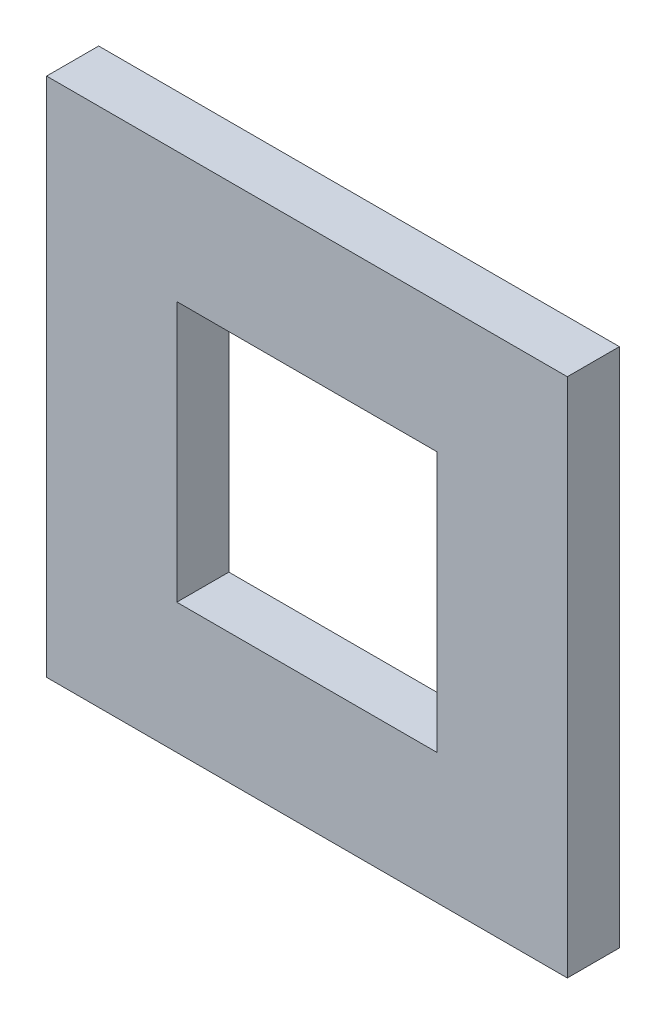
ISO-10303-21;
HEADER;
FILE_DESCRIPTION(('STEP AP214'),'2;1');
FILE_NAME('part.step','',(''),(''),'','','');
FILE_SCHEMA(('AUTOMOTIVE_DESIGN { 1 0 10303 214 1 1 1 1 }'));
ENDSEC;
DATA;
#1=APPLICATION_CONTEXT('core data for automotive mechanical design processes');
#2=APPLICATION_PROTOCOL_DEFINITION('international standard','automotive_design',2000,#1);
#3=PRODUCT_CONTEXT('',#1,'mechanical');
#4=PRODUCT('Part','Part','',(#3));
#5=PRODUCT_RELATED_PRODUCT_CATEGORY('part','',(#4));
#6=PRODUCT_DEFINITION_FORMATION('','',#4);
#7=PRODUCT_DEFINITION_CONTEXT('part definition',#1,'design');
#8=PRODUCT_DEFINITION('design','',#6,#7);
#9=PRODUCT_DEFINITION_SHAPE('','',#8);
#10=(LENGTH_UNIT() NAMED_UNIT(*) SI_UNIT(.MILLI.,.METRE.));
#11=(NAMED_UNIT(*) PLANE_ANGLE_UNIT() SI_UNIT($,.RADIAN.));
#12=(NAMED_UNIT(*) SI_UNIT($,.STERADIAN.) SOLID_ANGLE_UNIT());
#13=UNCERTAINTY_MEASURE_WITH_UNIT(LENGTH_MEASURE(1.E-05),#10,'distance_accuracy_value','');
#14=(GEOMETRIC_REPRESENTATION_CONTEXT(3) GLOBAL_UNCERTAINTY_ASSIGNED_CONTEXT((#13)) GLOBAL_UNIT_ASSIGNED_CONTEXT((#10,
#11,#12)) REPRESENTATION_CONTEXT('',''));
#15=CARTESIAN_POINT('',(0.,0.,0.));
#16=DIRECTION('',(0.,0.,1.));
#17=DIRECTION('',(1.,0.,0.));
#18=AXIS2_PLACEMENT_3D('',#15,#16,#17);
#19=CARTESIAN_POINT('',(12.5,-12.5,2.5));
#20=DIRECTION('',(-1.,0.,0.));
#21=DIRECTION('',(0.,0.,1.));
#22=AXIS2_PLACEMENT_3D('',#19,#20,#21);
#23=PLANE('',#22);
#24=DIRECTION('',(0.,1.,0.));
#25=VECTOR('',#24,1.);
#26=CARTESIAN_POINT('',(12.5,-12.5,0.));
#27=LINE('',#26,#25);
#28=CARTESIAN_POINT('',(12.5,-12.5,0.));
#29=VERTEX_POINT('',#28);
#30=CARTESIAN_POINT('',(12.5,12.5,0.));
#31=VERTEX_POINT('',#30);
#32=EDGE_CURVE('E147',#29,#31,#27,.T.);
#33=ORIENTED_EDGE('',*,*,#32,.T.);
#34=DIRECTION('',(0.,0.,-1.));
#35=VECTOR('',#34,1.);
#36=CARTESIAN_POINT('',(12.5,12.5,2.5));
#37=LINE('',#36,#35);
#38=CARTESIAN_POINT('',(12.5,12.5,2.5));
#39=VERTEX_POINT('',#38);
#40=EDGE_CURVE('E11',#39,#31,#37,.T.);
#41=ORIENTED_EDGE('',*,*,#40,.F.);
#42=DIRECTION('',(0.,1.,0.));
#43=VECTOR('',#42,1.);
#44=CARTESIAN_POINT('',(12.5,-12.5,2.5));
#45=LINE('',#44,#43);
#46=CARTESIAN_POINT('',(12.5,-12.5,2.5));
#47=VERTEX_POINT('',#46);
#48=EDGE_CURVE('E153',#47,#39,#45,.T.);
#49=ORIENTED_EDGE('',*,*,#48,.F.);
#50=DIRECTION('',(0.,0.,-1.));
#51=VECTOR('',#50,1.);
#52=CARTESIAN_POINT('',(12.5,-12.5,2.5));
#53=LINE('',#52,#51);
#54=EDGE_CURVE('E167',#47,#29,#53,.T.);
#55=ORIENTED_EDGE('',*,*,#54,.T.);
#56=EDGE_LOOP('',(#33,#41,#49,#55));
#57=FACE_BOUND('',#56,.T.);
#58=ADVANCED_FACE('F39',(#57),#23,.F.);
#59=CARTESIAN_POINT('',(-12.5,12.5,2.5));
#60=DIRECTION('',(0.,-1.,0.));
#61=DIRECTION('',(0.,0.,-1.));
#62=AXIS2_PLACEMENT_3D('',#59,#60,#61);
#63=PLANE('',#62);
#64=DIRECTION('',(-1.,0.,0.));
#65=VECTOR('',#64,1.);
#66=CARTESIAN_POINT('',(-12.5,12.5,0.));
#67=LINE('',#66,#65);
#68=CARTESIAN_POINT('',(-12.5,12.5,0.));
#69=VERTEX_POINT('',#68);
#70=EDGE_CURVE('E171',#31,#69,#67,.T.);
#71=ORIENTED_EDGE('',*,*,#70,.T.);
#72=DIRECTION('',(0.,0.,-1.));
#73=VECTOR('',#72,1.);
#74=CARTESIAN_POINT('',(-12.5,12.5,2.5));
#75=LINE('',#74,#73);
#76=CARTESIAN_POINT('',(-12.5,12.5,2.5));
#77=VERTEX_POINT('',#76);
#78=EDGE_CURVE('E47',#77,#69,#75,.T.);
#79=ORIENTED_EDGE('',*,*,#78,.F.);
#80=DIRECTION('',(-1.,0.,0.));
#81=VECTOR('',#80,1.);
#82=CARTESIAN_POINT('',(-12.5,12.5,2.5));
#83=LINE('',#82,#81);
#84=EDGE_CURVE('E157',#39,#77,#83,.T.);
#85=ORIENTED_EDGE('',*,*,#84,.F.);
#86=ORIENTED_EDGE('',*,*,#40,.T.);
#87=EDGE_LOOP('',(#71,#79,#85,#86));
#88=FACE_BOUND('',#87,.T.);
#89=ADVANCED_FACE('F205',(#88),#63,.F.);
#90=CARTESIAN_POINT('',(-12.5,-12.5,2.5));
#91=DIRECTION('',(1.,0.,0.));
#92=DIRECTION('',(0.,0.,-1.));
#93=AXIS2_PLACEMENT_3D('',#90,#91,#92);
#94=PLANE('',#93);
#95=DIRECTION('',(0.,-1.,0.));
#96=VECTOR('',#95,1.);
#97=CARTESIAN_POINT('',(-12.5,-12.5,0.));
#98=LINE('',#97,#96);
#99=CARTESIAN_POINT('',(-12.5,-12.5,0.));
#100=VERTEX_POINT('',#99);
#101=EDGE_CURVE('E174',#69,#100,#98,.T.);
#102=ORIENTED_EDGE('',*,*,#101,.T.);
#103=DIRECTION('',(0.,0.,-1.));
#104=VECTOR('',#103,1.);
#105=CARTESIAN_POINT('',(-12.5,-12.5,2.5));
#106=LINE('',#105,#104);
#107=CARTESIAN_POINT('',(-12.5,-12.5,2.5));
#108=VERTEX_POINT('',#107);
#109=EDGE_CURVE('E182',#108,#100,#106,.T.);
#110=ORIENTED_EDGE('',*,*,#109,.F.);
#111=DIRECTION('',(0.,-1.,0.));
#112=VECTOR('',#111,1.);
#113=CARTESIAN_POINT('',(-12.5,-12.5,2.5));
#114=LINE('',#113,#112);
#115=EDGE_CURVE('E161',#77,#108,#114,.T.);
#116=ORIENTED_EDGE('',*,*,#115,.F.);
#117=ORIENTED_EDGE('',*,*,#78,.T.);
#118=EDGE_LOOP('',(#102,#110,#116,#117));
#119=FACE_BOUND('',#118,.T.);
#120=ADVANCED_FACE('F191',(#119),#94,.F.);
#121=CARTESIAN_POINT('',(-12.5,-12.5,2.5));
#122=DIRECTION('',(0.,1.,0.));
#123=DIRECTION('',(0.,0.,1.));
#124=AXIS2_PLACEMENT_3D('',#121,#122,#123);
#125=PLANE('',#124);
#126=DIRECTION('',(1.,0.,0.));
#127=VECTOR('',#126,1.);
#128=CARTESIAN_POINT('',(-12.5,-12.5,0.));
#129=LINE('',#128,#127);
#130=EDGE_CURVE('E158',#100,#29,#129,.T.);
#131=ORIENTED_EDGE('',*,*,#130,.T.);
#132=ORIENTED_EDGE('',*,*,#54,.F.);
#133=DIRECTION('',(1.,0.,0.));
#134=VECTOR('',#133,1.);
#135=CARTESIAN_POINT('',(-12.5,-12.5,2.5));
#136=LINE('',#135,#134);
#137=EDGE_CURVE('E164',#108,#47,#136,.T.);
#138=ORIENTED_EDGE('',*,*,#137,.F.);
#139=ORIENTED_EDGE('',*,*,#109,.T.);
#140=EDGE_LOOP('',(#131,#132,#138,#139));
#141=FACE_BOUND('',#140,.T.);
#142=ADVANCED_FACE('F198',(#141),#125,.F.);
#143=CARTESIAN_POINT('',(0.,0.,2.5));
#144=DIRECTION('',(0.,0.,-1.));
#145=DIRECTION('',(-1.,0.,0.));
#146=AXIS2_PLACEMENT_3D('',#143,#144,#145);
#147=PLANE('',#146);
#148=DIRECTION('',(-1.,0.,0.));
#149=VECTOR('',#148,1.);
#150=CARTESIAN_POINT('',(-6.25,6.25,2.5));
#151=LINE('',#150,#149);
#152=CARTESIAN_POINT('',(6.25,6.25,2.5));
#153=VERTEX_POINT('',#152);
#154=CARTESIAN_POINT('',(-6.25,6.25,2.5));
#155=VERTEX_POINT('',#154);
#156=EDGE_CURVE('E138',#153,#155,#151,.T.);
#157=ORIENTED_EDGE('',*,*,#156,.F.);
#158=DIRECTION('',(0.,1.,0.));
#159=VECTOR('',#158,1.);
#160=CARTESIAN_POINT('',(6.25,-6.25,2.5));
#161=LINE('',#160,#159);
#162=CARTESIAN_POINT('',(6.25,-6.25,2.5));
#163=VERTEX_POINT('',#162);
#164=EDGE_CURVE('E54',#163,#153,#161,.T.);
#165=ORIENTED_EDGE('',*,*,#164,.F.);
#166=DIRECTION('',(1.,0.,0.));
#167=VECTOR('',#166,1.);
#168=CARTESIAN_POINT('',(-6.25,-6.25,2.5));
#169=LINE('',#168,#167);
#170=CARTESIAN_POINT('',(-6.25,-6.25,2.5));
#171=VERTEX_POINT('',#170);
#172=EDGE_CURVE('E125',#171,#163,#169,.T.);
#173=ORIENTED_EDGE('',*,*,#172,.F.);
#174=DIRECTION('',(0.,-1.,0.));
#175=VECTOR('',#174,1.);
#176=CARTESIAN_POINT('',(-6.25,-6.25,2.5));
#177=LINE('',#176,#175);
#178=EDGE_CURVE('E129',#155,#171,#177,.T.);
#179=ORIENTED_EDGE('',*,*,#178,.F.);
#180=EDGE_LOOP('',(#157,#165,#173,#179));
#181=FACE_BOUND('',#180,.T.);
#182=ORIENTED_EDGE('',*,*,#48,.T.);
#183=ORIENTED_EDGE('',*,*,#84,.T.);
#184=ORIENTED_EDGE('',*,*,#115,.T.);
#185=ORIENTED_EDGE('',*,*,#137,.T.);
#186=EDGE_LOOP('',(#182,#183,#184,#185));
#187=FACE_BOUND('',#186,.T.);
#188=ADVANCED_FACE('F204',(#181,#187),#147,.F.);
#189=CARTESIAN_POINT('',(0.,0.,0.));
#190=DIRECTION('',(0.,0.,-1.));
#191=DIRECTION('',(-1.,0.,0.));
#192=AXIS2_PLACEMENT_3D('',#189,#190,#191);
#193=PLANE('',#192);
#194=DIRECTION('',(0.,1.,0.));
#195=VECTOR('',#194,1.);
#196=CARTESIAN_POINT('',(6.25,-6.25,0.));
#197=LINE('',#196,#195);
#198=CARTESIAN_POINT('',(6.25,-6.25,0.));
#199=VERTEX_POINT('',#198);
#200=CARTESIAN_POINT('',(6.25,6.25,0.));
#201=VERTEX_POINT('',#200);
#202=EDGE_CURVE('E106',#199,#201,#197,.T.);
#203=ORIENTED_EDGE('',*,*,#202,.T.);
#204=DIRECTION('',(-1.,0.,0.));
#205=VECTOR('',#204,1.);
#206=CARTESIAN_POINT('',(-6.25,6.25,0.));
#207=LINE('',#206,#205);
#208=CARTESIAN_POINT('',(-6.25,6.25,0.));
#209=VERTEX_POINT('',#208);
#210=EDGE_CURVE('E116',#201,#209,#207,.T.);
#211=ORIENTED_EDGE('',*,*,#210,.T.);
#212=DIRECTION('',(0.,-1.,0.));
#213=VECTOR('',#212,1.);
#214=CARTESIAN_POINT('',(-6.25,-6.25,0.));
#215=LINE('',#214,#213);
#216=CARTESIAN_POINT('',(-6.25,-6.25,0.));
#217=VERTEX_POINT('',#216);
#218=EDGE_CURVE('E62',#209,#217,#215,.T.);
#219=ORIENTED_EDGE('',*,*,#218,.T.);
#220=DIRECTION('',(1.,0.,0.));
#221=VECTOR('',#220,1.);
#222=CARTESIAN_POINT('',(-6.25,-6.25,0.));
#223=LINE('',#222,#221);
#224=EDGE_CURVE('E113',#217,#199,#223,.T.);
#225=ORIENTED_EDGE('',*,*,#224,.T.);
#226=EDGE_LOOP('',(#203,#211,#219,#225));
#227=FACE_BOUND('',#226,.T.);
#228=ORIENTED_EDGE('',*,*,#32,.F.);
#229=ORIENTED_EDGE('',*,*,#130,.F.);
#230=ORIENTED_EDGE('',*,*,#101,.F.);
#231=ORIENTED_EDGE('',*,*,#70,.F.);
#232=EDGE_LOOP('',(#228,#229,#230,#231));
#233=FACE_BOUND('',#232,.T.);
#234=ADVANCED_FACE('F121',(#227,#233),#193,.T.);
#235=CARTESIAN_POINT('',(6.25,-6.25,0.));
#236=DIRECTION('',(1.,0.,0.));
#237=DIRECTION('',(0.,0.,-1.));
#238=AXIS2_PLACEMENT_3D('',#235,#236,#237);
#239=PLANE('',#238);
#240=ORIENTED_EDGE('',*,*,#164,.T.);
#241=DIRECTION('',(0.,0.,1.));
#242=VECTOR('',#241,1.);
#243=CARTESIAN_POINT('',(6.25,6.25,0.));
#244=LINE('',#243,#242);
#245=EDGE_CURVE('E102',#201,#153,#244,.T.);
#246=ORIENTED_EDGE('',*,*,#245,.F.);
#247=ORIENTED_EDGE('',*,*,#202,.F.);
#248=DIRECTION('',(0.,0.,1.));
#249=VECTOR('',#248,1.);
#250=CARTESIAN_POINT('',(6.25,-6.25,0.));
#251=LINE('',#250,#249);
#252=EDGE_CURVE('E144',#199,#163,#251,.T.);
#253=ORIENTED_EDGE('',*,*,#252,.T.);
#254=EDGE_LOOP('',(#240,#246,#247,#253));
#255=FACE_BOUND('',#254,.T.);
#256=ADVANCED_FACE('F104',(#255),#239,.F.);
#257=CARTESIAN_POINT('',(-6.25,-6.25,0.));
#258=DIRECTION('',(0.,-1.,0.));
#259=DIRECTION('',(0.,0.,-1.));
#260=AXIS2_PLACEMENT_3D('',#257,#258,#259);
#261=PLANE('',#260);
#262=ORIENTED_EDGE('',*,*,#172,.T.);
#263=ORIENTED_EDGE('',*,*,#252,.F.);
#264=ORIENTED_EDGE('',*,*,#224,.F.);
#265=DIRECTION('',(0.,0.,1.));
#266=VECTOR('',#265,1.);
#267=CARTESIAN_POINT('',(-6.25,-6.25,0.));
#268=LINE('',#267,#266);
#269=EDGE_CURVE('E148',#217,#171,#268,.T.);
#270=ORIENTED_EDGE('',*,*,#269,.T.);
#271=EDGE_LOOP('',(#262,#263,#264,#270));
#272=FACE_BOUND('',#271,.T.);
#273=ADVANCED_FACE('F222',(#272),#261,.F.);
#274=CARTESIAN_POINT('',(-6.25,-6.25,0.));
#275=DIRECTION('',(-1.,0.,0.));
#276=DIRECTION('',(0.,0.,1.));
#277=AXIS2_PLACEMENT_3D('',#274,#275,#276);
#278=PLANE('',#277);
#279=ORIENTED_EDGE('',*,*,#178,.T.);
#280=ORIENTED_EDGE('',*,*,#269,.F.);
#281=ORIENTED_EDGE('',*,*,#218,.F.);
#282=DIRECTION('',(0.,0.,1.));
#283=VECTOR('',#282,1.);
#284=CARTESIAN_POINT('',(-6.25,6.25,0.));
#285=LINE('',#284,#283);
#286=EDGE_CURVE('E112',#209,#155,#285,.T.);
#287=ORIENTED_EDGE('',*,*,#286,.T.);
#288=EDGE_LOOP('',(#279,#280,#281,#287));
#289=FACE_BOUND('',#288,.T.);
#290=ADVANCED_FACE('F225',(#289),#278,.F.);
#291=CARTESIAN_POINT('',(-6.25,6.25,0.));
#292=DIRECTION('',(0.,1.,0.));
#293=DIRECTION('',(0.,0.,1.));
#294=AXIS2_PLACEMENT_3D('',#291,#292,#293);
#295=PLANE('',#294);
#296=ORIENTED_EDGE('',*,*,#156,.T.);
#297=ORIENTED_EDGE('',*,*,#286,.F.);
#298=ORIENTED_EDGE('',*,*,#210,.F.);
#299=ORIENTED_EDGE('',*,*,#245,.T.);
#300=EDGE_LOOP('',(#296,#297,#298,#299));
#301=FACE_BOUND('',#300,.T.);
#302=ADVANCED_FACE('F117',(#301),#295,.F.);
#303=CLOSED_SHELL('',(#58,#89,#120,#142,#188,#234,#256,#273,#290,#302));
#304=MANIFOLD_SOLID_BREP('B2',#303);
#305=ADVANCED_BREP_SHAPE_REPRESENTATION('',(#18,#304),#14);
#306=SHAPE_DEFINITION_REPRESENTATION(#9,#305);
ENDSEC;
END-ISO-10303-21;
